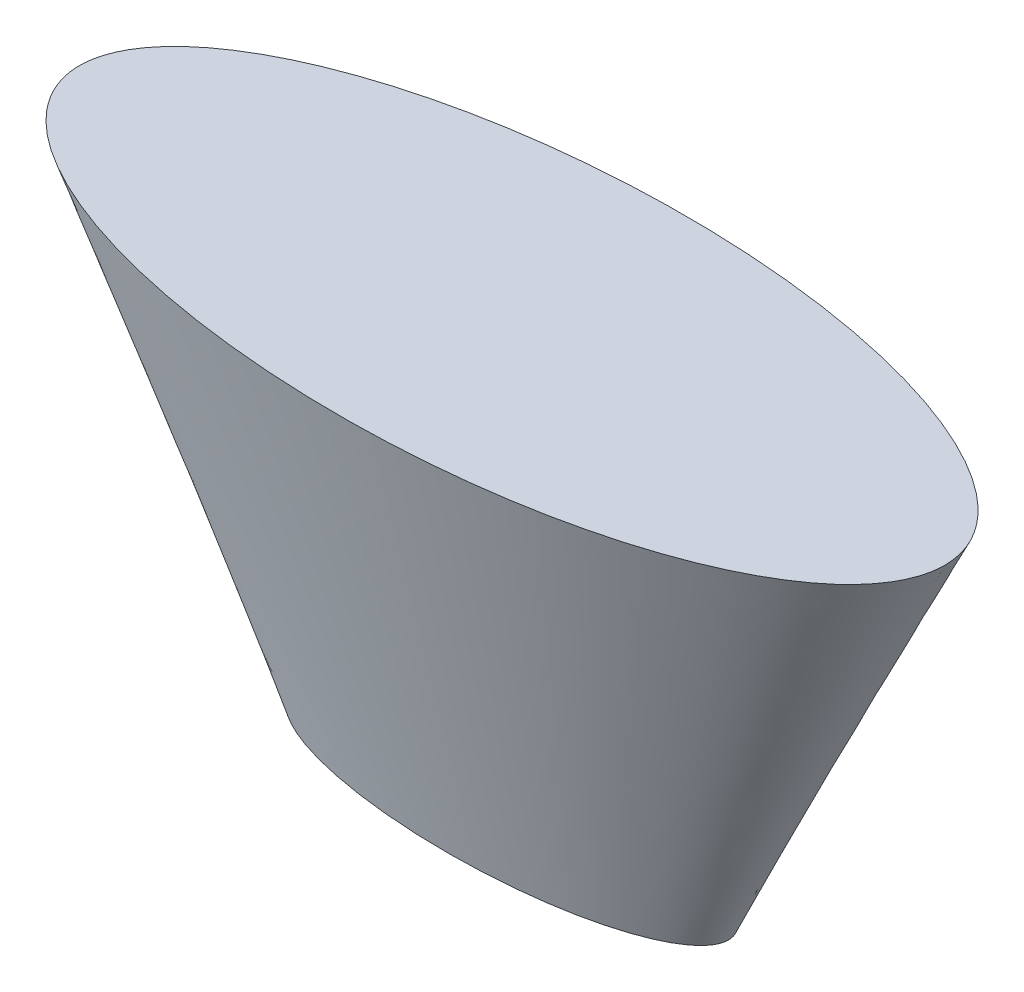
ISO-10303-21;
HEADER;
FILE_DESCRIPTION(('STEP AP214'),'2;1');
FILE_NAME('part.step','',(''),(''),'','','');
FILE_SCHEMA(('AUTOMOTIVE_DESIGN { 1 0 10303 214 1 1 1 1 }'));
ENDSEC;
DATA;
#1=APPLICATION_CONTEXT('core data for automotive mechanical design processes');
#2=APPLICATION_PROTOCOL_DEFINITION('international standard','automotive_design',2000,#1);
#3=PRODUCT_CONTEXT('',#1,'mechanical');
#4=PRODUCT('Part','Part','',(#3));
#5=PRODUCT_RELATED_PRODUCT_CATEGORY('part','',(#4));
#6=PRODUCT_DEFINITION_FORMATION('','',#4);
#7=PRODUCT_DEFINITION_CONTEXT('part definition',#1,'design');
#8=PRODUCT_DEFINITION('design','',#6,#7);
#9=PRODUCT_DEFINITION_SHAPE('','',#8);
#10=(LENGTH_UNIT() NAMED_UNIT(*) SI_UNIT(.MILLI.,.METRE.));
#11=(NAMED_UNIT(*) PLANE_ANGLE_UNIT() SI_UNIT($,.RADIAN.));
#12=(NAMED_UNIT(*) SI_UNIT($,.STERADIAN.) SOLID_ANGLE_UNIT());
#13=UNCERTAINTY_MEASURE_WITH_UNIT(LENGTH_MEASURE(1.E-05),#10,'distance_accuracy_value','');
#14=(GEOMETRIC_REPRESENTATION_CONTEXT(3) GLOBAL_UNCERTAINTY_ASSIGNED_CONTEXT((#13)) GLOBAL_UNIT_ASSIGNED_CONTEXT((#10,
#11,#12)) REPRESENTATION_CONTEXT('',''));
#15=CARTESIAN_POINT('',(0.,0.,0.));
#16=DIRECTION('',(0.,0.,1.));
#17=DIRECTION('',(1.,0.,0.));
#18=AXIS2_PLACEMENT_3D('',#15,#16,#17);
#19=CARTESIAN_POINT('',(0.,10.,0.));
#20=DIRECTION('',(0.,1.,0.));
#21=DIRECTION('',(0.,0.,1.));
#22=AXIS2_PLACEMENT_3D('',#19,#20,#21);
#23=PLANE('',#22);
#24=CARTESIAN_POINT('',(0.,10.,0.));
#25=DIRECTION('',(0.,1.,0.));
#26=DIRECTION('',(1.,0.,0.));
#27=AXIS2_PLACEMENT_3D('',#24,#25,#26);
#28=ELLIPSE('',#27,20.,8.);
#29=CARTESIAN_POINT('',(20.,10.,0.));
#30=VERTEX_POINT('',#29);
#31=EDGE_CURVE('E11',#30,#30,#28,.T.);
#32=ORIENTED_EDGE('',*,*,#31,.T.);
#33=EDGE_LOOP('',(#32));
#34=FACE_BOUND('',#33,.T.);
#35=ADVANCED_FACE('F49',(#34),#23,.T.);
#36=CARTESIAN_POINT('',(0.,-10.,0.));
#37=DIRECTION('',(0.,1.,0.));
#38=DIRECTION('',(0.,0.,1.));
#39=AXIS2_PLACEMENT_3D('',#36,#37,#38);
#40=PLANE('',#39);
#41=CARTESIAN_POINT('',(0.,-10.,0.));
#42=DIRECTION('',(0.,1.,0.));
#43=DIRECTION('',(1.,0.,0.));
#44=AXIS2_PLACEMENT_3D('',#41,#42,#43);
#45=ELLIPSE('',#44,10.,3.);
#46=CARTESIAN_POINT('',(10.,-10.,0.));
#47=VERTEX_POINT('',#46);
#48=EDGE_CURVE('E57',#47,#47,#45,.T.);
#49=ORIENTED_EDGE('',*,*,#48,.F.);
#50=EDGE_LOOP('',(#49));
#51=FACE_BOUND('',#50,.T.);
#52=ADVANCED_FACE('F80',(#51),#40,.F.);
#53=CARTESIAN_POINT('',(-9.60643517930928,-10.,-0.833352436317082));
#54=CARTESIAN_POINT('',(-17.9826085222542,10.,-3.50144634653395));
#55=CARTESIAN_POINT('',(-15.1621180880898,-10.,4.93050867126849));
#56=CARTESIAN_POINT('',(-35.489840254924,10.,10.8846404712694));
#57=CARTESIAN_POINT('',(4.05075227052873,-10.,6.59721354390265));
#58=CARTESIAN_POINT('',(0.475376789584512,10.,17.8875331643373));
#59=CARTESIAN_POINT('',(9.60643517930928,-10.,0.833352436317082));
#60=CARTESIAN_POINT('',(17.9826085222542,10.,3.50144634653394));
#61=CARTESIAN_POINT('',(15.1621180880898,-10.,-4.93050867126849));
#62=CARTESIAN_POINT('',(35.4898402549239,10.,-10.8846404712694));
#63=CARTESIAN_POINT('',(-4.05075227052874,-10.,-6.59721354390265));
#64=CARTESIAN_POINT('',(-0.475376789584529,10.,-17.8875331643373));
#65=CARTESIAN_POINT('',(-9.60643517930928,-10.,-0.833352436317082));
#66=CARTESIAN_POINT('',(-17.9826085222542,10.,-3.50144634653395));
#67=(BOUNDED_SURFACE() B_SPLINE_SURFACE(3,1,((#53,#54),(#55,#56),(#57,#58),(#59,#60),(#61,#62),
(#63,#64),(#65,#66)),.UNSPECIFIED.,.T.,.F.,.F.) B_SPLINE_SURFACE_WITH_KNOTS((4,3,4),(2,2),(0.,
0.5,1.),(0.,1.),.UNSPECIFIED.) GEOMETRIC_REPRESENTATION_ITEM() RATIONAL_B_SPLINE_SURFACE(((1.,
1.),(0.333333333333333,0.333333333333333),(0.333333333333333,0.333333333333333),(1.,1.),
(0.333333333333333,0.333333333333333),(0.333333333333333,0.333333333333333),(1.,1.))) REPRESENTATION_ITEM('') SURFACE());
#68=ORIENTED_EDGE('',*,*,#48,.T.);
#69=EDGE_LOOP('',(#68));
#70=FACE_BOUND('',#69,.T.);
#71=ORIENTED_EDGE('',*,*,#31,.F.);
#72=EDGE_LOOP('',(#71));
#73=FACE_BOUND('',#72,.T.);
#74=ADVANCED_FACE('F88',(#70,#73),#67,.T.);
#75=CLOSED_SHELL('',(#35,#52,#74));
#76=MANIFOLD_SOLID_BREP('B2',#75);
#77=ADVANCED_BREP_SHAPE_REPRESENTATION('',(#18,#76),#14);
#78=SHAPE_DEFINITION_REPRESENTATION(#9,#77);
ENDSEC;
END-ISO-10303-21;
